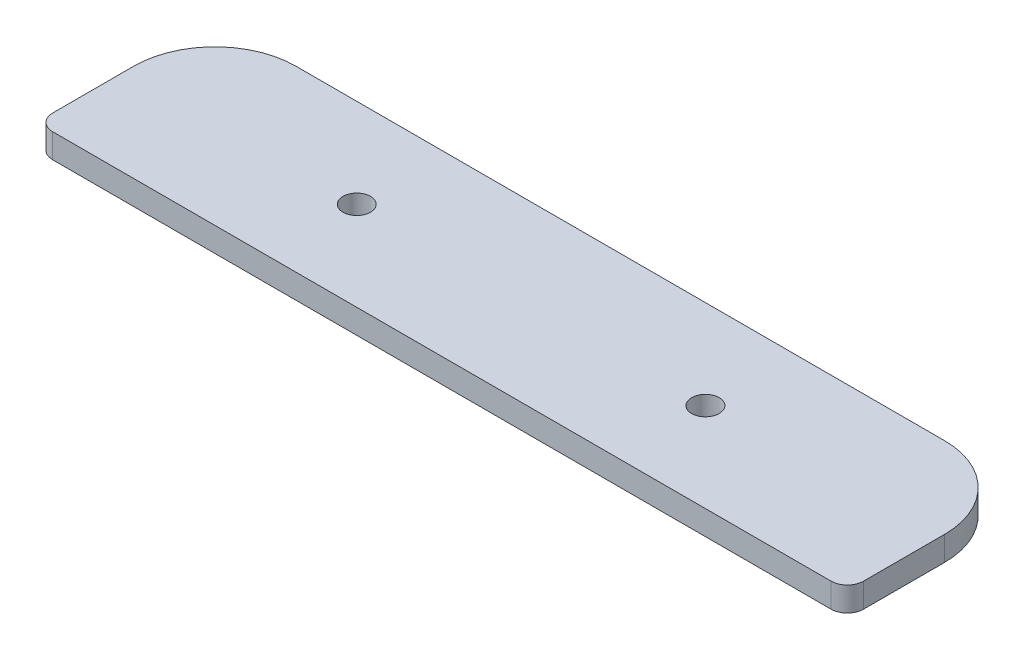
ISO-10303-21;
HEADER;
FILE_DESCRIPTION(('STEP AP214'),'2;1');
FILE_NAME('part.step','',(''),(''),'','','');
FILE_SCHEMA(('AUTOMOTIVE_DESIGN { 1 0 10303 214 1 1 1 1 }'));
ENDSEC;
DATA;
#1=APPLICATION_CONTEXT('core data for automotive mechanical design processes');
#2=APPLICATION_PROTOCOL_DEFINITION('international standard','automotive_design',2000,#1);
#3=PRODUCT_CONTEXT('',#1,'mechanical');
#4=PRODUCT('Part','Part','',(#3));
#5=PRODUCT_RELATED_PRODUCT_CATEGORY('part','',(#4));
#6=PRODUCT_DEFINITION_FORMATION('','',#4);
#7=PRODUCT_DEFINITION_CONTEXT('part definition',#1,'design');
#8=PRODUCT_DEFINITION('design','',#6,#7);
#9=PRODUCT_DEFINITION_SHAPE('','',#8);
#10=(LENGTH_UNIT() NAMED_UNIT(*) SI_UNIT(.MILLI.,.METRE.));
#11=(NAMED_UNIT(*) PLANE_ANGLE_UNIT() SI_UNIT($,.RADIAN.));
#12=(NAMED_UNIT(*) SI_UNIT($,.STERADIAN.) SOLID_ANGLE_UNIT());
#13=UNCERTAINTY_MEASURE_WITH_UNIT(LENGTH_MEASURE(1.E-05),#10,'distance_accuracy_value','');
#14=(GEOMETRIC_REPRESENTATION_CONTEXT(3) GLOBAL_UNCERTAINTY_ASSIGNED_CONTEXT((#13)) GLOBAL_UNIT_ASSIGNED_CONTEXT((#10,
#11,#12)) REPRESENTATION_CONTEXT('',''));
#15=CARTESIAN_POINT('',(0.,0.,0.));
#16=DIRECTION('',(0.,0.,1.));
#17=DIRECTION('',(1.,0.,0.));
#18=AXIS2_PLACEMENT_3D('',#15,#16,#17);
#19=CARTESIAN_POINT('',(-50.,15.,-50.));
#20=DIRECTION('',(1.,0.,0.));
#21=DIRECTION('',(0.,0.,-1.));
#22=AXIS2_PLACEMENT_3D('',#19,#20,#21);
#23=PLANE('',#22);
#24=DIRECTION('',(0.,0.,1.));
#25=VECTOR('',#24,1.);
#26=CARTESIAN_POINT('',(-50.,12.,-50.));
#27=LINE('',#26,#25);
#28=CARTESIAN_POINT('',(-50.,12.,-40.));
#29=VERTEX_POINT('',#28);
#30=CARTESIAN_POINT('',(-50.,12.,-30.));
#31=VERTEX_POINT('',#30);
#32=EDGE_CURVE('E123',#29,#31,#27,.T.);
#33=ORIENTED_EDGE('',*,*,#32,.T.);
#34=DIRECTION('',(0.,-1.,0.));
#35=VECTOR('',#34,1.);
#36=CARTESIAN_POINT('',(-50.,15.,-30.));
#37=LINE('',#36,#35);
#38=CARTESIAN_POINT('',(-50.,15.,-30.));
#39=VERTEX_POINT('',#38);
#40=EDGE_CURVE('E61',#31,#39,#37,.F.);
#41=ORIENTED_EDGE('',*,*,#40,.T.);
#42=DIRECTION('',(0.,0.,1.));
#43=VECTOR('',#42,1.);
#44=CARTESIAN_POINT('',(-50.,15.,-50.));
#45=LINE('',#44,#43);
#46=CARTESIAN_POINT('',(-50.,15.,-40.));
#47=VERTEX_POINT('',#46);
#48=EDGE_CURVE('E122',#47,#39,#45,.T.);
#49=ORIENTED_EDGE('',*,*,#48,.F.);
#50=DIRECTION('',(0.,-1.,0.));
#51=VECTOR('',#50,1.);
#52=CARTESIAN_POINT('',(-50.,15.,-40.));
#53=LINE('',#52,#51);
#54=EDGE_CURVE('E111',#47,#29,#53,.T.);
#55=ORIENTED_EDGE('',*,*,#54,.T.);
#56=EDGE_LOOP('',(#33,#41,#49,#55));
#57=FACE_BOUND('',#56,.T.);
#58=ADVANCED_FACE('F41',(#57),#23,.F.);
#59=CARTESIAN_POINT('',(-50.,15.,-28.));
#60=DIRECTION('',(0.,0.,-1.));
#61=DIRECTION('',(-1.,0.,0.));
#62=AXIS2_PLACEMENT_3D('',#59,#60,#61);
#63=PLANE('',#62);
#64=DIRECTION('',(1.,0.,0.));
#65=VECTOR('',#64,1.);
#66=CARTESIAN_POINT('',(-50.,15.,-28.));
#67=LINE('',#66,#65);
#68=CARTESIAN_POINT('',(-48.,15.,-28.));
#69=VERTEX_POINT('',#68);
#70=CARTESIAN_POINT('',(48.,15.,-28.));
#71=VERTEX_POINT('',#70);
#72=EDGE_CURVE('E194',#69,#71,#67,.T.);
#73=ORIENTED_EDGE('',*,*,#72,.F.);
#74=DIRECTION('',(0.,-1.,0.));
#75=VECTOR('',#74,1.);
#76=CARTESIAN_POINT('',(-48.,15.,-28.));
#77=LINE('',#76,#75);
#78=CARTESIAN_POINT('',(-48.,12.,-28.));
#79=VERTEX_POINT('',#78);
#80=EDGE_CURVE('E174',#69,#79,#77,.T.);
#81=ORIENTED_EDGE('',*,*,#80,.T.);
#82=DIRECTION('',(1.,0.,0.));
#83=VECTOR('',#82,1.);
#84=CARTESIAN_POINT('',(-50.,12.,-28.));
#85=LINE('',#84,#83);
#86=CARTESIAN_POINT('',(48.,12.,-28.));
#87=VERTEX_POINT('',#86);
#88=EDGE_CURVE('E133',#79,#87,#85,.T.);
#89=ORIENTED_EDGE('',*,*,#88,.T.);
#90=DIRECTION('',(0.,-1.,0.));
#91=VECTOR('',#90,1.);
#92=CARTESIAN_POINT('',(48.,15.,-28.));
#93=LINE('',#92,#91);
#94=EDGE_CURVE('E172',#87,#71,#93,.F.);
#95=ORIENTED_EDGE('',*,*,#94,.T.);
#96=EDGE_LOOP('',(#73,#81,#89,#95));
#97=FACE_BOUND('',#96,.T.);
#98=ADVANCED_FACE('F192',(#97),#63,.F.);
#99=CARTESIAN_POINT('',(50.,15.,-50.));
#100=DIRECTION('',(-1.,0.,0.));
#101=DIRECTION('',(0.,0.,1.));
#102=AXIS2_PLACEMENT_3D('',#99,#100,#101);
#103=PLANE('',#102);
#104=DIRECTION('',(0.,0.,-1.));
#105=VECTOR('',#104,1.);
#106=CARTESIAN_POINT('',(50.,15.,-50.));
#107=LINE('',#106,#105);
#108=CARTESIAN_POINT('',(50.,15.,-30.));
#109=VERTEX_POINT('',#108);
#110=CARTESIAN_POINT('',(50.,15.,-40.));
#111=VERTEX_POINT('',#110);
#112=EDGE_CURVE('E196',#109,#111,#107,.T.);
#113=ORIENTED_EDGE('',*,*,#112,.F.);
#114=DIRECTION('',(0.,-1.,0.));
#115=VECTOR('',#114,1.);
#116=CARTESIAN_POINT('',(50.,15.,-30.));
#117=LINE('',#116,#115);
#118=CARTESIAN_POINT('',(50.,12.,-30.));
#119=VERTEX_POINT('',#118);
#120=EDGE_CURVE('E11',#109,#119,#117,.T.);
#121=ORIENTED_EDGE('',*,*,#120,.T.);
#122=DIRECTION('',(0.,0.,-1.));
#123=VECTOR('',#122,1.);
#124=CARTESIAN_POINT('',(50.,12.,-50.));
#125=LINE('',#124,#123);
#126=CARTESIAN_POINT('',(50.,12.,-40.));
#127=VERTEX_POINT('',#126);
#128=EDGE_CURVE('E137',#119,#127,#125,.T.);
#129=ORIENTED_EDGE('',*,*,#128,.T.);
#130=DIRECTION('',(0.,-1.,0.));
#131=VECTOR('',#130,1.);
#132=CARTESIAN_POINT('',(50.,15.,-40.));
#133=LINE('',#132,#131);
#134=EDGE_CURVE('E170',#127,#111,#133,.F.);
#135=ORIENTED_EDGE('',*,*,#134,.T.);
#136=EDGE_LOOP('',(#113,#121,#129,#135));
#137=FACE_BOUND('',#136,.T.);
#138=ADVANCED_FACE('F216',(#137),#103,.F.);
#139=CARTESIAN_POINT('',(-50.,15.,-50.));
#140=DIRECTION('',(0.,0.,1.));
#141=DIRECTION('',(1.,0.,0.));
#142=AXIS2_PLACEMENT_3D('',#139,#140,#141);
#143=PLANE('',#142);
#144=DIRECTION('',(-1.,0.,0.));
#145=VECTOR('',#144,1.);
#146=CARTESIAN_POINT('',(-50.,12.,-50.));
#147=LINE('',#146,#145);
#148=CARTESIAN_POINT('',(40.,12.,-50.));
#149=VERTEX_POINT('',#148);
#150=CARTESIAN_POINT('',(-40.,12.,-50.));
#151=VERTEX_POINT('',#150);
#152=EDGE_CURVE('E147',#149,#151,#147,.T.);
#153=ORIENTED_EDGE('',*,*,#152,.T.);
#154=DIRECTION('',(0.,-1.,0.));
#155=VECTOR('',#154,1.);
#156=CARTESIAN_POINT('',(-40.,15.,-50.));
#157=LINE('',#156,#155);
#158=CARTESIAN_POINT('',(-40.,15.,-50.));
#159=VERTEX_POINT('',#158);
#160=EDGE_CURVE('E113',#151,#159,#157,.F.);
#161=ORIENTED_EDGE('',*,*,#160,.T.);
#162=DIRECTION('',(-1.,0.,0.));
#163=VECTOR('',#162,1.);
#164=CARTESIAN_POINT('',(-50.,15.,-50.));
#165=LINE('',#164,#163);
#166=CARTESIAN_POINT('',(40.,15.,-50.));
#167=VERTEX_POINT('',#166);
#168=EDGE_CURVE('E130',#167,#159,#165,.T.);
#169=ORIENTED_EDGE('',*,*,#168,.F.);
#170=DIRECTION('',(0.,-1.,0.));
#171=VECTOR('',#170,1.);
#172=CARTESIAN_POINT('',(40.,15.,-50.));
#173=LINE('',#172,#171);
#174=EDGE_CURVE('E124',#167,#149,#173,.T.);
#175=ORIENTED_EDGE('',*,*,#174,.T.);
#176=EDGE_LOOP('',(#153,#161,#169,#175));
#177=FACE_BOUND('',#176,.T.);
#178=ADVANCED_FACE('F236',(#177),#143,.F.);
#179=CARTESIAN_POINT('',(0.,15.,0.));
#180=DIRECTION('',(0.,1.,0.));
#181=DIRECTION('',(0.,0.,1.));
#182=AXIS2_PLACEMENT_3D('',#179,#180,#181);
#183=PLANE('',#182);
#184=CARTESIAN_POINT('',(-21.5,15.,-39.));
#185=DIRECTION('',(0.,1.,0.));
#186=DIRECTION('',(0.,0.,1.));
#187=AXIS2_PLACEMENT_3D('',#184,#185,#186);
#188=CIRCLE('',#187,1.7);
#189=CARTESIAN_POINT('',(-21.5,15.,-37.3));
#190=VERTEX_POINT('',#189);
#191=EDGE_CURVE('E141',#190,#190,#188,.T.);
#192=ORIENTED_EDGE('',*,*,#191,.F.);
#193=EDGE_LOOP('',(#192));
#194=FACE_BOUND('',#193,.T.);
#195=CARTESIAN_POINT('',(21.5,15.,-39.));
#196=DIRECTION('',(0.,1.,0.));
#197=DIRECTION('',(0.,0.,1.));
#198=AXIS2_PLACEMENT_3D('',#195,#196,#197);
#199=CIRCLE('',#198,1.7);
#200=CARTESIAN_POINT('',(21.5,15.,-37.3));
#201=VERTEX_POINT('',#200);
#202=EDGE_CURVE('E270',#201,#201,#199,.T.);
#203=ORIENTED_EDGE('',*,*,#202,.F.);
#204=EDGE_LOOP('',(#203));
#205=FACE_BOUND('',#204,.T.);
#206=ORIENTED_EDGE('',*,*,#48,.T.);
#207=CARTESIAN_POINT('',(-48.,15.,-30.));
#208=DIRECTION('',(0.,1.,0.));
#209=DIRECTION('',(0.,0.,1.));
#210=AXIS2_PLACEMENT_3D('',#207,#208,#209);
#211=CIRCLE('',#210,2.);
#212=EDGE_CURVE('E49',#39,#69,#211,.T.);
#213=ORIENTED_EDGE('',*,*,#212,.T.);
#214=ORIENTED_EDGE('',*,*,#72,.T.);
#215=CARTESIAN_POINT('',(48.,15.,-30.));
#216=DIRECTION('',(0.,1.,0.));
#217=DIRECTION('',(0.,0.,1.));
#218=AXIS2_PLACEMENT_3D('',#215,#216,#217);
#219=CIRCLE('',#218,2.);
#220=EDGE_CURVE('E60',#71,#109,#219,.T.);
#221=ORIENTED_EDGE('',*,*,#220,.T.);
#222=ORIENTED_EDGE('',*,*,#112,.T.);
#223=CARTESIAN_POINT('',(40.,15.,-40.));
#224=DIRECTION('',(0.,1.,0.));
#225=DIRECTION('',(0.,0.,1.));
#226=AXIS2_PLACEMENT_3D('',#223,#224,#225);
#227=CIRCLE('',#226,10.);
#228=EDGE_CURVE('E161',#111,#167,#227,.T.);
#229=ORIENTED_EDGE('',*,*,#228,.T.);
#230=ORIENTED_EDGE('',*,*,#168,.T.);
#231=CARTESIAN_POINT('',(-40.,15.,-40.));
#232=DIRECTION('',(0.,1.,0.));
#233=DIRECTION('',(0.,0.,1.));
#234=AXIS2_PLACEMENT_3D('',#231,#232,#233);
#235=CIRCLE('',#234,10.);
#236=EDGE_CURVE('E163',#159,#47,#235,.T.);
#237=ORIENTED_EDGE('',*,*,#236,.T.);
#238=EDGE_LOOP('',(#206,#213,#214,#221,#222,#229,#230,#237));
#239=FACE_BOUND('',#238,.T.);
#240=ADVANCED_FACE('F186',(#194,#205,#239),#183,.T.);
#241=CARTESIAN_POINT('',(0.,12.,0.));
#242=DIRECTION('',(0.,1.,0.));
#243=DIRECTION('',(0.,0.,1.));
#244=AXIS2_PLACEMENT_3D('',#241,#242,#243);
#245=PLANE('',#244);
#246=CARTESIAN_POINT('',(-21.5,12.,-39.));
#247=DIRECTION('',(0.,1.,0.));
#248=DIRECTION('',(0.,0.,1.));
#249=AXIS2_PLACEMENT_3D('',#246,#247,#248);
#250=CIRCLE('',#249,1.7);
#251=CARTESIAN_POINT('',(-21.5,12.,-37.3));
#252=VERTEX_POINT('',#251);
#253=EDGE_CURVE('E134',#252,#252,#250,.F.);
#254=ORIENTED_EDGE('',*,*,#253,.F.);
#255=EDGE_LOOP('',(#254));
#256=FACE_BOUND('',#255,.T.);
#257=CARTESIAN_POINT('',(21.5,12.,-39.));
#258=DIRECTION('',(0.,1.,0.));
#259=DIRECTION('',(0.,0.,1.));
#260=AXIS2_PLACEMENT_3D('',#257,#258,#259);
#261=CIRCLE('',#260,1.7);
#262=CARTESIAN_POINT('',(21.5,12.,-37.3));
#263=VERTEX_POINT('',#262);
#264=EDGE_CURVE('E271',#263,#263,#261,.F.);
#265=ORIENTED_EDGE('',*,*,#264,.F.);
#266=EDGE_LOOP('',(#265));
#267=FACE_BOUND('',#266,.T.);
#268=ORIENTED_EDGE('',*,*,#88,.F.);
#269=CARTESIAN_POINT('',(-48.,12.,-30.));
#270=DIRECTION('',(0.,1.,0.));
#271=DIRECTION('',(0.,0.,1.));
#272=AXIS2_PLACEMENT_3D('',#269,#270,#271);
#273=CIRCLE('',#272,2.);
#274=EDGE_CURVE('E132',#79,#31,#273,.F.);
#275=ORIENTED_EDGE('',*,*,#274,.T.);
#276=ORIENTED_EDGE('',*,*,#32,.F.);
#277=CARTESIAN_POINT('',(-40.,12.,-40.));
#278=DIRECTION('',(0.,1.,0.));
#279=DIRECTION('',(0.,0.,1.));
#280=AXIS2_PLACEMENT_3D('',#277,#278,#279);
#281=CIRCLE('',#280,10.);
#282=EDGE_CURVE('E109',#29,#151,#281,.F.);
#283=ORIENTED_EDGE('',*,*,#282,.T.);
#284=ORIENTED_EDGE('',*,*,#152,.F.);
#285=CARTESIAN_POINT('',(40.,12.,-40.));
#286=DIRECTION('',(0.,1.,0.));
#287=DIRECTION('',(0.,0.,1.));
#288=AXIS2_PLACEMENT_3D('',#285,#286,#287);
#289=CIRCLE('',#288,10.);
#290=EDGE_CURVE('E121',#149,#127,#289,.F.);
#291=ORIENTED_EDGE('',*,*,#290,.T.);
#292=ORIENTED_EDGE('',*,*,#128,.F.);
#293=CARTESIAN_POINT('',(48.,12.,-30.));
#294=DIRECTION('',(0.,1.,0.));
#295=DIRECTION('',(0.,0.,1.));
#296=AXIS2_PLACEMENT_3D('',#293,#294,#295);
#297=CIRCLE('',#296,2.);
#298=EDGE_CURVE('E180',#119,#87,#297,.F.);
#299=ORIENTED_EDGE('',*,*,#298,.T.);
#300=EDGE_LOOP('',(#268,#275,#276,#283,#284,#291,#292,#299));
#301=FACE_BOUND('',#300,.T.);
#302=ADVANCED_FACE('F128',(#256,#267,#301),#245,.F.);
#303=CARTESIAN_POINT('',(21.5,7.19167388793148,-39.));
#304=DIRECTION('',(0.,1.,0.));
#305=DIRECTION('',(0.,0.,1.));
#306=AXIS2_PLACEMENT_3D('',#303,#304,#305);
#307=CYLINDRICAL_SURFACE('',#306,1.7);
#308=ORIENTED_EDGE('',*,*,#264,.T.);
#309=EDGE_LOOP('',(#308));
#310=FACE_BOUND('',#309,.T.);
#311=ORIENTED_EDGE('',*,*,#202,.T.);
#312=EDGE_LOOP('',(#311));
#313=FACE_BOUND('',#312,.T.);
#314=ADVANCED_FACE('F227',(#310,#313),#307,.F.);
#315=CARTESIAN_POINT('',(-21.5,7.19167388793148,-39.));
#316=DIRECTION('',(0.,1.,0.));
#317=DIRECTION('',(0.,0.,1.));
#318=AXIS2_PLACEMENT_3D('',#315,#316,#317);
#319=CYLINDRICAL_SURFACE('',#318,1.7);
#320=ORIENTED_EDGE('',*,*,#253,.T.);
#321=EDGE_LOOP('',(#320));
#322=FACE_BOUND('',#321,.T.);
#323=ORIENTED_EDGE('',*,*,#191,.T.);
#324=EDGE_LOOP('',(#323));
#325=FACE_BOUND('',#324,.T.);
#326=ADVANCED_FACE('F222',(#322,#325),#319,.F.);
#327=CARTESIAN_POINT('',(-40.,15.,-40.));
#328=DIRECTION('',(0.,-1.,0.));
#329=DIRECTION('',(0.,0.,-1.));
#330=AXIS2_PLACEMENT_3D('',#327,#328,#329);
#331=CYLINDRICAL_SURFACE('',#330,10.);
#332=ORIENTED_EDGE('',*,*,#236,.F.);
#333=ORIENTED_EDGE('',*,*,#160,.F.);
#334=ORIENTED_EDGE('',*,*,#282,.F.);
#335=ORIENTED_EDGE('',*,*,#54,.F.);
#336=EDGE_LOOP('',(#332,#333,#334,#335));
#337=FACE_BOUND('',#336,.T.);
#338=ADVANCED_FACE('F114',(#337),#331,.T.);
#339=CARTESIAN_POINT('',(40.,15.,-40.));
#340=DIRECTION('',(0.,-1.,0.));
#341=DIRECTION('',(0.,0.,-1.));
#342=AXIS2_PLACEMENT_3D('',#339,#340,#341);
#343=CYLINDRICAL_SURFACE('',#342,10.);
#344=ORIENTED_EDGE('',*,*,#228,.F.);
#345=ORIENTED_EDGE('',*,*,#134,.F.);
#346=ORIENTED_EDGE('',*,*,#290,.F.);
#347=ORIENTED_EDGE('',*,*,#174,.F.);
#348=EDGE_LOOP('',(#344,#345,#346,#347));
#349=FACE_BOUND('',#348,.T.);
#350=ADVANCED_FACE('F205',(#349),#343,.T.);
#351=CARTESIAN_POINT('',(-48.,15.,-30.));
#352=DIRECTION('',(0.,-1.,0.));
#353=DIRECTION('',(0.,0.,-1.));
#354=AXIS2_PLACEMENT_3D('',#351,#352,#353);
#355=CYLINDRICAL_SURFACE('',#354,2.);
#356=ORIENTED_EDGE('',*,*,#212,.F.);
#357=ORIENTED_EDGE('',*,*,#40,.F.);
#358=ORIENTED_EDGE('',*,*,#274,.F.);
#359=ORIENTED_EDGE('',*,*,#80,.F.);
#360=EDGE_LOOP('',(#356,#357,#358,#359));
#361=FACE_BOUND('',#360,.T.);
#362=ADVANCED_FACE('F199',(#361),#355,.T.);
#363=CARTESIAN_POINT('',(48.,15.,-30.));
#364=DIRECTION('',(0.,-1.,0.));
#365=DIRECTION('',(0.,0.,-1.));
#366=AXIS2_PLACEMENT_3D('',#363,#364,#365);
#367=CYLINDRICAL_SURFACE('',#366,2.);
#368=ORIENTED_EDGE('',*,*,#220,.F.);
#369=ORIENTED_EDGE('',*,*,#94,.F.);
#370=ORIENTED_EDGE('',*,*,#298,.F.);
#371=ORIENTED_EDGE('',*,*,#120,.F.);
#372=EDGE_LOOP('',(#368,#369,#370,#371));
#373=FACE_BOUND('',#372,.T.);
#374=ADVANCED_FACE('F43',(#373),#367,.T.);
#375=CLOSED_SHELL('',(#58,#98,#138,#178,#240,#302,#314,#326,#338,#350,#362,#374));
#376=MANIFOLD_SOLID_BREP('B2',#375);
#377=ADVANCED_BREP_SHAPE_REPRESENTATION('',(#18,#376),#14);
#378=SHAPE_DEFINITION_REPRESENTATION(#9,#377);
ENDSEC;
END-ISO-10303-21;
